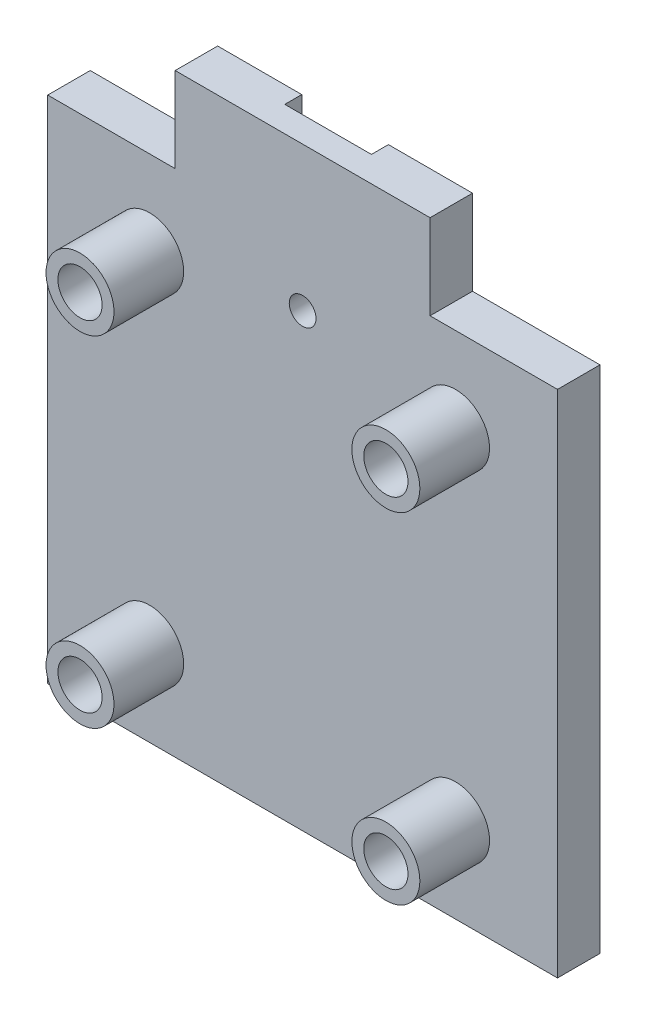
ISO-10303-21;
HEADER;
FILE_DESCRIPTION(('STEP AP214'),'2;1');
FILE_NAME('part.step','',(''),(''),'','','');
FILE_SCHEMA(('AUTOMOTIVE_DESIGN { 1 0 10303 214 1 1 1 1 }'));
ENDSEC;
DATA;
#1=APPLICATION_CONTEXT('core data for automotive mechanical design processes');
#2=APPLICATION_PROTOCOL_DEFINITION('international standard','automotive_design',2000,#1);
#3=PRODUCT_CONTEXT('',#1,'mechanical');
#4=PRODUCT('Part','Part','',(#3));
#5=PRODUCT_RELATED_PRODUCT_CATEGORY('part','',(#4));
#6=PRODUCT_DEFINITION_FORMATION('','',#4);
#7=PRODUCT_DEFINITION_CONTEXT('part definition',#1,'design');
#8=PRODUCT_DEFINITION('design','',#6,#7);
#9=PRODUCT_DEFINITION_SHAPE('','',#8);
#10=(LENGTH_UNIT() NAMED_UNIT(*) SI_UNIT(.MILLI.,.METRE.));
#11=(NAMED_UNIT(*) PLANE_ANGLE_UNIT() SI_UNIT($,.RADIAN.));
#12=(NAMED_UNIT(*) SI_UNIT($,.STERADIAN.) SOLID_ANGLE_UNIT());
#13=UNCERTAINTY_MEASURE_WITH_UNIT(LENGTH_MEASURE(1.E-05),#10,'distance_accuracy_value','');
#14=(GEOMETRIC_REPRESENTATION_CONTEXT(3) GLOBAL_UNCERTAINTY_ASSIGNED_CONTEXT((#13)) GLOBAL_UNIT_ASSIGNED_CONTEXT((#10,
#11,#12)) REPRESENTATION_CONTEXT('',''));
#15=CARTESIAN_POINT('',(0.,0.,0.));
#16=DIRECTION('',(0.,0.,1.));
#17=DIRECTION('',(1.,0.,0.));
#18=AXIS2_PLACEMENT_3D('',#15,#16,#17);
#19=CARTESIAN_POINT('',(0.,0.,0.));
#20=DIRECTION('',(0.,0.,-1.));
#21=DIRECTION('',(-1.,0.,0.));
#22=AXIS2_PLACEMENT_3D('',#19,#20,#21);
#23=PLANE('',#22);
#24=CARTESIAN_POINT('',(-22.86,25.4,0.));
#25=DIRECTION('',(0.,0.,1.));
#26=DIRECTION('',(-1.,0.,0.));
#27=AXIS2_PLACEMENT_3D('',#24,#25,#26);
#28=CIRCLE('',#27,3.302);
#29=CARTESIAN_POINT('',(-26.162,25.4,0.));
#30=VERTEX_POINT('',#29);
#31=EDGE_CURVE('E198',#30,#30,#28,.T.);
#32=ORIENTED_EDGE('',*,*,#31,.T.);
#33=EDGE_LOOP('',(#32));
#34=FACE_BOUND('',#33,.T.);
#35=CARTESIAN_POINT('',(22.86,25.4,0.));
#36=DIRECTION('',(0.,0.,1.));
#37=DIRECTION('',(1.,0.,0.));
#38=AXIS2_PLACEMENT_3D('',#35,#36,#37);
#39=CIRCLE('',#38,3.302);
#40=CARTESIAN_POINT('',(26.162,25.4,0.));
#41=VERTEX_POINT('',#40);
#42=EDGE_CURVE('E207',#41,#41,#39,.T.);
#43=ORIENTED_EDGE('',*,*,#42,.T.);
#44=EDGE_LOOP('',(#43));
#45=FACE_BOUND('',#44,.T.);
#46=CARTESIAN_POINT('',(-22.86,-25.4,0.));
#47=DIRECTION('',(0.,0.,-1.));
#48=DIRECTION('',(-1.,0.,0.));
#49=AXIS2_PLACEMENT_3D('',#46,#47,#48);
#50=CIRCLE('',#49,3.302);
#51=CARTESIAN_POINT('',(-26.162,-25.4,0.));
#52=VERTEX_POINT('',#51);
#53=EDGE_CURVE('E190',#52,#52,#50,.T.);
#54=ORIENTED_EDGE('',*,*,#53,.F.);
#55=EDGE_LOOP('',(#54));
#56=FACE_BOUND('',#55,.T.);
#57=CARTESIAN_POINT('',(22.86,-25.4,0.));
#58=DIRECTION('',(0.,0.,-1.));
#59=DIRECTION('',(1.,0.,0.));
#60=AXIS2_PLACEMENT_3D('',#57,#58,#59);
#61=CIRCLE('',#60,3.302);
#62=CARTESIAN_POINT('',(26.162,-25.4,0.));
#63=VERTEX_POINT('',#62);
#64=EDGE_CURVE('E183',#63,#63,#61,.T.);
#65=ORIENTED_EDGE('',*,*,#64,.F.);
#66=EDGE_LOOP('',(#65));
#67=FACE_BOUND('',#66,.T.);
#68=DIRECTION('',(1.,0.,0.));
#69=VECTOR('',#68,1.);
#70=CARTESIAN_POINT('',(-6.477,24.67,0.));
#71=LINE('',#70,#69);
#72=CARTESIAN_POINT('',(-6.477,24.67,0.));
#73=VERTEX_POINT('',#72);
#74=CARTESIAN_POINT('',(6.477,24.67,0.));
#75=VERTEX_POINT('',#74);
#76=EDGE_CURVE('E144',#73,#75,#71,.T.);
#77=ORIENTED_EDGE('',*,*,#76,.T.);
#78=DIRECTION('',(0.,1.,0.));
#79=VECTOR('',#78,1.);
#80=CARTESIAN_POINT('',(6.477,24.67,0.));
#81=LINE('',#80,#79);
#82=CARTESIAN_POINT('',(6.477,50.8,0.));
#83=VERTEX_POINT('',#82);
#84=EDGE_CURVE('E616',#75,#83,#81,.T.);
#85=ORIENTED_EDGE('',*,*,#84,.T.);
#86=DIRECTION('',(-1.,0.,0.));
#87=VECTOR('',#86,1.);
#88=CARTESIAN_POINT('',(-19.05,50.8,0.));
#89=LINE('',#88,#87);
#90=CARTESIAN_POINT('',(19.05,50.8,0.));
#91=VERTEX_POINT('',#90);
#92=EDGE_CURVE('E149',#91,#83,#89,.T.);
#93=ORIENTED_EDGE('',*,*,#92,.F.);
#94=DIRECTION('',(0.,1.,0.));
#95=VECTOR('',#94,1.);
#96=CARTESIAN_POINT('',(19.05,38.1,0.));
#97=LINE('',#96,#95);
#98=CARTESIAN_POINT('',(19.05,38.1,0.));
#99=VERTEX_POINT('',#98);
#100=EDGE_CURVE('E174',#99,#91,#97,.T.);
#101=ORIENTED_EDGE('',*,*,#100,.F.);
#102=DIRECTION('',(-1.,0.,0.));
#103=VECTOR('',#102,1.);
#104=CARTESIAN_POINT('',(-19.05,38.1,0.));
#105=LINE('',#104,#103);
#106=CARTESIAN_POINT('',(38.1,38.1,0.));
#107=VERTEX_POINT('',#106);
#108=EDGE_CURVE('E255',#107,#99,#105,.T.);
#109=ORIENTED_EDGE('',*,*,#108,.F.);
#110=DIRECTION('',(0.,1.,0.));
#111=VECTOR('',#110,1.);
#112=CARTESIAN_POINT('',(38.1,38.1,0.));
#113=LINE('',#112,#111);
#114=CARTESIAN_POINT('',(38.1,-38.1,0.));
#115=VERTEX_POINT('',#114);
#116=EDGE_CURVE('E242',#115,#107,#113,.T.);
#117=ORIENTED_EDGE('',*,*,#116,.F.);
#118=DIRECTION('',(1.,0.,0.));
#119=VECTOR('',#118,1.);
#120=CARTESIAN_POINT('',(-19.05,-38.1,0.));
#121=LINE('',#120,#119);
#122=CARTESIAN_POINT('',(-38.1,-38.1,0.));
#123=VERTEX_POINT('',#122);
#124=EDGE_CURVE('E258',#123,#115,#121,.T.);
#125=ORIENTED_EDGE('',*,*,#124,.F.);
#126=DIRECTION('',(0.,-1.,0.));
#127=VECTOR('',#126,1.);
#128=CARTESIAN_POINT('',(-38.1,38.1,0.));
#129=LINE('',#128,#127);
#130=CARTESIAN_POINT('',(-38.1,38.1,0.));
#131=VERTEX_POINT('',#130);
#132=EDGE_CURVE('E230',#131,#123,#129,.T.);
#133=ORIENTED_EDGE('',*,*,#132,.F.);
#134=CARTESIAN_POINT('',(-19.05,38.1,0.));
#135=VERTEX_POINT('',#134);
#136=EDGE_CURVE('E236',#135,#131,#105,.T.);
#137=ORIENTED_EDGE('',*,*,#136,.F.);
#138=DIRECTION('',(0.,-1.,0.));
#139=VECTOR('',#138,1.);
#140=CARTESIAN_POINT('',(-19.05,38.1,0.));
#141=LINE('',#140,#139);
#142=CARTESIAN_POINT('',(-19.05,50.8,0.));
#143=VERTEX_POINT('',#142);
#144=EDGE_CURVE('E168',#143,#135,#141,.T.);
#145=ORIENTED_EDGE('',*,*,#144,.F.);
#146=CARTESIAN_POINT('',(-6.477,50.8,0.));
#147=VERTEX_POINT('',#146);
#148=EDGE_CURVE('E173',#147,#143,#89,.T.);
#149=ORIENTED_EDGE('',*,*,#148,.F.);
#150=DIRECTION('',(0.,-1.,0.));
#151=VECTOR('',#150,1.);
#152=CARTESIAN_POINT('',(-6.477,24.67,0.));
#153=LINE('',#152,#151);
#154=EDGE_CURVE('E614',#147,#73,#153,.T.);
#155=ORIENTED_EDGE('',*,*,#154,.T.);
#156=EDGE_LOOP('',(#77,#85,#93,#101,#109,#117,#125,#133,#137,#145,#149,#155));
#157=FACE_BOUND('',#156,.T.);
#158=ADVANCED_FACE('F38',(#34,#45,#56,#67,#157),#23,.T.);
#159=CARTESIAN_POINT('',(-19.05,50.8,-40.1609262841384));
#160=DIRECTION('',(0.,1.,0.));
#161=DIRECTION('',(0.,0.,1.));
#162=AXIS2_PLACEMENT_3D('',#159,#160,#161);
#163=PLANE('',#162);
#164=ORIENTED_EDGE('',*,*,#92,.T.);
#165=DIRECTION('',(0.,0.,-1.));
#166=VECTOR('',#165,1.);
#167=CARTESIAN_POINT('',(6.477,50.8,2.54));
#168=LINE('',#167,#166);
#169=CARTESIAN_POINT('',(6.477,50.8,2.54));
#170=VERTEX_POINT('',#169);
#171=EDGE_CURVE('E141',#170,#83,#168,.T.);
#172=ORIENTED_EDGE('',*,*,#171,.F.);
#173=DIRECTION('',(-1.,0.,0.));
#174=VECTOR('',#173,1.);
#175=CARTESIAN_POINT('',(-6.477,50.8,2.54));
#176=LINE('',#175,#174);
#177=CARTESIAN_POINT('',(-6.477,50.8,2.54));
#178=VERTEX_POINT('',#177);
#179=EDGE_CURVE('E128',#170,#178,#176,.T.);
#180=ORIENTED_EDGE('',*,*,#179,.T.);
#181=DIRECTION('',(0.,0.,-1.));
#182=VECTOR('',#181,1.);
#183=CARTESIAN_POINT('',(-6.477,50.8,2.54));
#184=LINE('',#183,#182);
#185=EDGE_CURVE('E150',#178,#147,#184,.T.);
#186=ORIENTED_EDGE('',*,*,#185,.T.);
#187=ORIENTED_EDGE('',*,*,#148,.T.);
#188=DIRECTION('',(0.,0.,1.));
#189=VECTOR('',#188,1.);
#190=CARTESIAN_POINT('',(-19.05,50.8,-40.1609262841384));
#191=LINE('',#190,#189);
#192=CARTESIAN_POINT('',(-19.05,50.8,6.35));
#193=VERTEX_POINT('',#192);
#194=EDGE_CURVE('E171',#143,#193,#191,.T.);
#195=ORIENTED_EDGE('',*,*,#194,.T.);
#196=DIRECTION('',(-1.,0.,0.));
#197=VECTOR('',#196,1.);
#198=CARTESIAN_POINT('',(-19.05,50.8,6.35));
#199=LINE('',#198,#197);
#200=CARTESIAN_POINT('',(19.05,50.8,6.35));
#201=VERTEX_POINT('',#200);
#202=EDGE_CURVE('E161',#201,#193,#199,.T.);
#203=ORIENTED_EDGE('',*,*,#202,.F.);
#204=DIRECTION('',(0.,0.,1.));
#205=VECTOR('',#204,1.);
#206=CARTESIAN_POINT('',(19.05,50.8,-40.1609262841384));
#207=LINE('',#206,#205);
#208=EDGE_CURVE('E177',#91,#201,#207,.T.);
#209=ORIENTED_EDGE('',*,*,#208,.F.);
#210=EDGE_LOOP('',(#164,#172,#180,#186,#187,#195,#203,#209));
#211=FACE_BOUND('',#210,.T.);
#212=ADVANCED_FACE('F147',(#211),#163,.T.);
#213=CARTESIAN_POINT('',(0.,29.21,16.764));
#214=DIRECTION('',(0.,0.,-1.));
#215=DIRECTION('',(-1.,0.,0.));
#216=AXIS2_PLACEMENT_3D('',#213,#214,#215);
#217=CYLINDRICAL_SURFACE('',#216,2.);
#218=CARTESIAN_POINT('',(0.,29.21,6.35));
#219=DIRECTION('',(0.,0.,-1.));
#220=DIRECTION('',(-1.,0.,0.));
#221=AXIS2_PLACEMENT_3D('',#218,#219,#220);
#222=CIRCLE('',#221,2.);
#223=CARTESIAN_POINT('',(-2.00000000000001,29.21,6.35));
#224=VERTEX_POINT('',#223);
#225=EDGE_CURVE('E153',#224,#224,#222,.T.);
#226=ORIENTED_EDGE('',*,*,#225,.F.);
#227=EDGE_LOOP('',(#226));
#228=FACE_BOUND('',#227,.T.);
#229=CARTESIAN_POINT('',(0.,29.21,2.54));
#230=DIRECTION('',(0.,0.,-1.));
#231=DIRECTION('',(-1.,0.,0.));
#232=AXIS2_PLACEMENT_3D('',#229,#230,#231);
#233=CIRCLE('',#232,2.);
#234=CARTESIAN_POINT('',(-2.00000000000001,29.21,2.54));
#235=VERTEX_POINT('',#234);
#236=EDGE_CURVE('E42',#235,#235,#233,.F.);
#237=ORIENTED_EDGE('',*,*,#236,.F.);
#238=EDGE_LOOP('',(#237));
#239=FACE_BOUND('',#238,.T.);
#240=ADVANCED_FACE('F320',(#228,#239),#217,.F.);
#241=CARTESIAN_POINT('',(-19.05,38.1,6.35));
#242=DIRECTION('',(0.,-1.,0.));
#243=DIRECTION('',(0.,0.,-1.));
#244=AXIS2_PLACEMENT_3D('',#241,#242,#243);
#245=PLANE('',#244);
#246=DIRECTION('',(0.,0.,1.));
#247=VECTOR('',#246,1.);
#248=CARTESIAN_POINT('',(-19.05,38.1,-40.1609262841384));
#249=LINE('',#248,#247);
#250=CARTESIAN_POINT('',(-19.05,38.1,6.35));
#251=VERTEX_POINT('',#250);
#252=EDGE_CURVE('E170',#135,#251,#249,.T.);
#253=ORIENTED_EDGE('',*,*,#252,.F.);
#254=ORIENTED_EDGE('',*,*,#136,.T.);
#255=DIRECTION('',(0.,0.,1.));
#256=VECTOR('',#255,1.);
#257=CARTESIAN_POINT('',(-38.1,38.1,-78.5451621680164));
#258=LINE('',#257,#256);
#259=CARTESIAN_POINT('',(-38.1,38.1,6.35));
#260=VERTEX_POINT('',#259);
#261=EDGE_CURVE('E228',#131,#260,#258,.T.);
#262=ORIENTED_EDGE('',*,*,#261,.T.);
#263=DIRECTION('',(-1.,0.,0.));
#264=VECTOR('',#263,1.);
#265=CARTESIAN_POINT('',(-19.05,38.1,6.35));
#266=LINE('',#265,#264);
#267=EDGE_CURVE('E253',#251,#260,#266,.T.);
#268=ORIENTED_EDGE('',*,*,#267,.F.);
#269=EDGE_LOOP('',(#253,#254,#262,#268));
#270=FACE_BOUND('',#269,.T.);
#271=ADVANCED_FACE('F291',(#270),#245,.F.);
#272=CARTESIAN_POINT('',(-38.1,38.1,-78.5451621680164));
#273=DIRECTION('',(-1.,0.,0.));
#274=DIRECTION('',(0.,-1.,0.));
#275=AXIS2_PLACEMENT_3D('',#272,#273,#274);
#276=PLANE('',#275);
#277=ORIENTED_EDGE('',*,*,#261,.F.);
#278=ORIENTED_EDGE('',*,*,#132,.T.);
#279=DIRECTION('',(0.,0.,1.));
#280=VECTOR('',#279,1.);
#281=CARTESIAN_POINT('',(-38.1,-38.1,-78.5451621680164));
#282=LINE('',#281,#280);
#283=CARTESIAN_POINT('',(-38.1,-38.1,6.35));
#284=VERTEX_POINT('',#283);
#285=EDGE_CURVE('E233',#123,#284,#282,.T.);
#286=ORIENTED_EDGE('',*,*,#285,.T.);
#287=DIRECTION('',(0.,-1.,0.));
#288=VECTOR('',#287,1.);
#289=CARTESIAN_POINT('',(-38.1,38.1,6.35));
#290=LINE('',#289,#288);
#291=EDGE_CURVE('E225',#260,#284,#290,.T.);
#292=ORIENTED_EDGE('',*,*,#291,.F.);
#293=EDGE_LOOP('',(#277,#278,#286,#292));
#294=FACE_BOUND('',#293,.T.);
#295=ADVANCED_FACE('F296',(#294),#276,.T.);
#296=ORIENTED_EDGE('',*,*,#108,.T.);
#297=DIRECTION('',(0.,0.,1.));
#298=VECTOR('',#297,1.);
#299=CARTESIAN_POINT('',(19.05,38.1,-40.1609262841384));
#300=LINE('',#299,#298);
#301=CARTESIAN_POINT('',(19.05,38.1,6.35));
#302=VERTEX_POINT('',#301);
#303=EDGE_CURVE('E164',#99,#302,#300,.T.);
#304=ORIENTED_EDGE('',*,*,#303,.T.);
#305=CARTESIAN_POINT('',(38.1,38.1,6.35));
#306=VERTEX_POINT('',#305);
#307=EDGE_CURVE('E249',#306,#302,#266,.T.);
#308=ORIENTED_EDGE('',*,*,#307,.F.);
#309=DIRECTION('',(0.,0.,1.));
#310=VECTOR('',#309,1.);
#311=CARTESIAN_POINT('',(38.1,38.1,-78.5451621680164));
#312=LINE('',#311,#310);
#313=EDGE_CURVE('E222',#107,#306,#312,.T.);
#314=ORIENTED_EDGE('',*,*,#313,.F.);
#315=EDGE_LOOP('',(#296,#304,#308,#314));
#316=FACE_BOUND('',#315,.T.);
#317=ADVANCED_FACE('F40',(#316),#245,.F.);
#318=CARTESIAN_POINT('',(-19.05,-38.1,6.35));
#319=DIRECTION('',(0.,1.,0.));
#320=DIRECTION('',(0.,0.,1.));
#321=AXIS2_PLACEMENT_3D('',#318,#319,#320);
#322=PLANE('',#321);
#323=ORIENTED_EDGE('',*,*,#124,.T.);
#324=DIRECTION('',(0.,0.,1.));
#325=VECTOR('',#324,1.);
#326=CARTESIAN_POINT('',(38.1,-38.1,-78.5451621680164));
#327=LINE('',#326,#325);
#328=CARTESIAN_POINT('',(38.1,-38.1,6.35));
#329=VERTEX_POINT('',#328);
#330=EDGE_CURVE('E239',#115,#329,#327,.T.);
#331=ORIENTED_EDGE('',*,*,#330,.T.);
#332=DIRECTION('',(1.,0.,0.));
#333=VECTOR('',#332,1.);
#334=CARTESIAN_POINT('',(-19.05,-38.1,6.35));
#335=LINE('',#334,#333);
#336=EDGE_CURVE('E252',#284,#329,#335,.T.);
#337=ORIENTED_EDGE('',*,*,#336,.F.);
#338=ORIENTED_EDGE('',*,*,#285,.F.);
#339=EDGE_LOOP('',(#323,#331,#337,#338));
#340=FACE_BOUND('',#339,.T.);
#341=ADVANCED_FACE('F269',(#340),#322,.F.);
#342=CARTESIAN_POINT('',(0.,0.,6.35));
#343=DIRECTION('',(0.,0.,-1.));
#344=DIRECTION('',(-1.,0.,0.));
#345=AXIS2_PLACEMENT_3D('',#342,#343,#344);
#346=PLANE('',#345);
#347=ORIENTED_EDGE('',*,*,#225,.T.);
#348=EDGE_LOOP('',(#347));
#349=FACE_BOUND('',#348,.T.);
#350=CARTESIAN_POINT('',(22.86,-25.4,6.35));
#351=DIRECTION('',(0.,0.,-1.));
#352=DIRECTION('',(1.,0.,0.));
#353=AXIS2_PLACEMENT_3D('',#350,#351,#352);
#354=CIRCLE('',#353,5.08);
#355=CARTESIAN_POINT('',(27.94,-25.4,6.35));
#356=VERTEX_POINT('',#355);
#357=EDGE_CURVE('E199',#356,#356,#354,.T.);
#358=ORIENTED_EDGE('',*,*,#357,.T.);
#359=EDGE_LOOP('',(#358));
#360=FACE_BOUND('',#359,.T.);
#361=CARTESIAN_POINT('',(-22.86,-25.4,6.35));
#362=DIRECTION('',(0.,0.,-1.));
#363=DIRECTION('',(-1.,0.,0.));
#364=AXIS2_PLACEMENT_3D('',#361,#362,#363);
#365=CIRCLE('',#364,5.08);
#366=CARTESIAN_POINT('',(-27.94,-25.4,6.35));
#367=VERTEX_POINT('',#366);
#368=EDGE_CURVE('E186',#367,#367,#365,.T.);
#369=ORIENTED_EDGE('',*,*,#368,.T.);
#370=EDGE_LOOP('',(#369));
#371=FACE_BOUND('',#370,.T.);
#372=CARTESIAN_POINT('',(22.86,25.4,6.35));
#373=DIRECTION('',(0.,0.,-1.));
#374=DIRECTION('',(-1.,0.,0.));
#375=AXIS2_PLACEMENT_3D('',#372,#373,#374);
#376=CIRCLE('',#375,5.08);
#377=CARTESIAN_POINT('',(17.78,25.4,6.35));
#378=VERTEX_POINT('',#377);
#379=EDGE_CURVE('E11',#378,#378,#376,.F.);
#380=ORIENTED_EDGE('',*,*,#379,.F.);
#381=EDGE_LOOP('',(#380));
#382=FACE_BOUND('',#381,.T.);
#383=CARTESIAN_POINT('',(-22.86,25.4,6.35));
#384=DIRECTION('',(0.,0.,-1.));
#385=DIRECTION('',(-1.,0.,0.));
#386=AXIS2_PLACEMENT_3D('',#383,#384,#385);
#387=CIRCLE('',#386,5.08);
#388=CARTESIAN_POINT('',(-27.94,25.4,6.35));
#389=VERTEX_POINT('',#388);
#390=EDGE_CURVE('E47',#389,#389,#387,.F.);
#391=ORIENTED_EDGE('',*,*,#390,.F.);
#392=EDGE_LOOP('',(#391));
#393=FACE_BOUND('',#392,.T.);
#394=ORIENTED_EDGE('',*,*,#336,.T.);
#395=DIRECTION('',(0.,1.,0.));
#396=VECTOR('',#395,1.);
#397=CARTESIAN_POINT('',(38.1,38.1,6.35));
#398=LINE('',#397,#396);
#399=EDGE_CURVE('E229',#329,#306,#398,.T.);
#400=ORIENTED_EDGE('',*,*,#399,.T.);
#401=ORIENTED_EDGE('',*,*,#307,.T.);
#402=DIRECTION('',(0.,1.,0.));
#403=VECTOR('',#402,1.);
#404=CARTESIAN_POINT('',(19.05,38.1,6.35));
#405=LINE('',#404,#403);
#406=EDGE_CURVE('E62',#302,#201,#405,.T.);
#407=ORIENTED_EDGE('',*,*,#406,.T.);
#408=ORIENTED_EDGE('',*,*,#202,.T.);
#409=DIRECTION('',(0.,-1.,0.));
#410=VECTOR('',#409,1.);
#411=CARTESIAN_POINT('',(-19.05,38.1,6.35));
#412=LINE('',#411,#410);
#413=EDGE_CURVE('E160',#193,#251,#412,.T.);
#414=ORIENTED_EDGE('',*,*,#413,.T.);
#415=ORIENTED_EDGE('',*,*,#267,.T.);
#416=ORIENTED_EDGE('',*,*,#291,.T.);
#417=EDGE_LOOP('',(#394,#400,#401,#407,#408,#414,#415,#416));
#418=FACE_BOUND('',#417,.T.);
#419=ADVANCED_FACE('F265',(#349,#360,#371,#382,#393,#418),#346,.F.);
#420=CARTESIAN_POINT('',(38.1,38.1,-78.5451621680164));
#421=DIRECTION('',(1.,0.,0.));
#422=DIRECTION('',(0.,1.,0.));
#423=AXIS2_PLACEMENT_3D('',#420,#421,#422);
#424=PLANE('',#423);
#425=ORIENTED_EDGE('',*,*,#330,.F.);
#426=ORIENTED_EDGE('',*,*,#116,.T.);
#427=ORIENTED_EDGE('',*,*,#313,.T.);
#428=ORIENTED_EDGE('',*,*,#399,.F.);
#429=EDGE_LOOP('',(#425,#426,#427,#428));
#430=FACE_BOUND('',#429,.T.);
#431=ADVANCED_FACE('F268',(#430),#424,.T.);
#432=CARTESIAN_POINT('',(-22.86,25.4,16.764));
#433=DIRECTION('',(0.,0.,-1.));
#434=DIRECTION('',(-1.,0.,0.));
#435=AXIS2_PLACEMENT_3D('',#432,#433,#434);
#436=CYLINDRICAL_SURFACE('',#435,5.08);
#437=CARTESIAN_POINT('',(-22.86,25.4,16.764));
#438=DIRECTION('',(0.,0.,1.));
#439=DIRECTION('',(-1.,0.,0.));
#440=AXIS2_PLACEMENT_3D('',#437,#438,#439);
#441=CIRCLE('',#440,5.08);
#442=CARTESIAN_POINT('',(-27.94,25.4,16.764));
#443=VERTEX_POINT('',#442);
#444=EDGE_CURVE('E210',#443,#443,#441,.T.);
#445=ORIENTED_EDGE('',*,*,#444,.F.);
#446=EDGE_LOOP('',(#445));
#447=FACE_BOUND('',#446,.T.);
#448=ORIENTED_EDGE('',*,*,#390,.T.);
#449=EDGE_LOOP('',(#448));
#450=FACE_BOUND('',#449,.T.);
#451=ADVANCED_FACE('F263',(#447,#450),#436,.T.);
#452=CARTESIAN_POINT('',(-22.86,25.4,16.764));
#453=DIRECTION('',(0.,0.,-1.));
#454=DIRECTION('',(-1.,0.,0.));
#455=AXIS2_PLACEMENT_3D('',#452,#453,#454);
#456=PLANE('',#455);
#457=CARTESIAN_POINT('',(-22.86,25.4,16.764));
#458=DIRECTION('',(0.,0.,1.));
#459=DIRECTION('',(-1.,0.,0.));
#460=AXIS2_PLACEMENT_3D('',#457,#458,#459);
#461=CIRCLE('',#460,3.302);
#462=CARTESIAN_POINT('',(-26.162,25.4,16.764));
#463=VERTEX_POINT('',#462);
#464=EDGE_CURVE('E214',#463,#463,#461,.T.);
#465=ORIENTED_EDGE('',*,*,#464,.F.);
#466=EDGE_LOOP('',(#465));
#467=FACE_BOUND('',#466,.T.);
#468=ORIENTED_EDGE('',*,*,#444,.T.);
#469=EDGE_LOOP('',(#468));
#470=FACE_BOUND('',#469,.T.);
#471=ADVANCED_FACE('F490',(#467,#470),#456,.F.);
#472=CARTESIAN_POINT('',(22.86,25.4,16.764));
#473=DIRECTION('',(0.,0.,-1.));
#474=DIRECTION('',(-1.,0.,0.));
#475=AXIS2_PLACEMENT_3D('',#472,#473,#474);
#476=CYLINDRICAL_SURFACE('',#475,5.08);
#477=CARTESIAN_POINT('',(22.86,25.4,16.764));
#478=DIRECTION('',(0.,0.,1.));
#479=DIRECTION('',(1.,0.,0.));
#480=AXIS2_PLACEMENT_3D('',#477,#478,#479);
#481=CIRCLE('',#480,5.08);
#482=CARTESIAN_POINT('',(27.94,25.4,16.764));
#483=VERTEX_POINT('',#482);
#484=EDGE_CURVE('E219',#483,#483,#481,.T.);
#485=ORIENTED_EDGE('',*,*,#484,.F.);
#486=EDGE_LOOP('',(#485));
#487=FACE_BOUND('',#486,.T.);
#488=ORIENTED_EDGE('',*,*,#379,.T.);
#489=EDGE_LOOP('',(#488));
#490=FACE_BOUND('',#489,.T.);
#491=ADVANCED_FACE('F481',(#487,#490),#476,.T.);
#492=CARTESIAN_POINT('',(22.86,25.4,16.764));
#493=DIRECTION('',(0.,0.,1.));
#494=DIRECTION('',(1.,0.,0.));
#495=AXIS2_PLACEMENT_3D('',#492,#493,#494);
#496=PLANE('',#495);
#497=CARTESIAN_POINT('',(22.86,25.4,16.764));
#498=DIRECTION('',(0.,0.,1.));
#499=DIRECTION('',(1.,0.,0.));
#500=AXIS2_PLACEMENT_3D('',#497,#498,#499);
#501=CIRCLE('',#500,3.302);
#502=CARTESIAN_POINT('',(26.162,25.4,16.764));
#503=VERTEX_POINT('',#502);
#504=EDGE_CURVE('E211',#503,#503,#501,.T.);
#505=ORIENTED_EDGE('',*,*,#504,.F.);
#506=EDGE_LOOP('',(#505));
#507=FACE_BOUND('',#506,.T.);
#508=ORIENTED_EDGE('',*,*,#484,.T.);
#509=EDGE_LOOP('',(#508));
#510=FACE_BOUND('',#509,.T.);
#511=ADVANCED_FACE('F472',(#507,#510),#496,.T.);
#512=CARTESIAN_POINT('',(22.86,25.4,0.));
#513=DIRECTION('',(0.,0.,1.));
#514=DIRECTION('',(1.,0.,0.));
#515=AXIS2_PLACEMENT_3D('',#512,#513,#514);
#516=CYLINDRICAL_SURFACE('',#515,3.302);
#517=ORIENTED_EDGE('',*,*,#42,.F.);
#518=EDGE_LOOP('',(#517));
#519=FACE_BOUND('',#518,.T.);
#520=ORIENTED_EDGE('',*,*,#504,.T.);
#521=EDGE_LOOP('',(#520));
#522=FACE_BOUND('',#521,.T.);
#523=ADVANCED_FACE('F463',(#519,#522),#516,.F.);
#524=CARTESIAN_POINT('',(-22.86,25.4,0.));
#525=DIRECTION('',(0.,0.,1.));
#526=DIRECTION('',(1.,0.,0.));
#527=AXIS2_PLACEMENT_3D('',#524,#525,#526);
#528=CYLINDRICAL_SURFACE('',#527,3.302);
#529=ORIENTED_EDGE('',*,*,#31,.F.);
#530=EDGE_LOOP('',(#529));
#531=FACE_BOUND('',#530,.T.);
#532=ORIENTED_EDGE('',*,*,#464,.T.);
#533=EDGE_LOOP('',(#532));
#534=FACE_BOUND('',#533,.T.);
#535=ADVANCED_FACE('F454',(#531,#534),#528,.F.);
#536=CARTESIAN_POINT('',(-22.86,-25.4,16.764));
#537=DIRECTION('',(0.,0.,-1.));
#538=DIRECTION('',(-1.,0.,0.));
#539=AXIS2_PLACEMENT_3D('',#536,#537,#538);
#540=CYLINDRICAL_SURFACE('',#539,5.08);
#541=CARTESIAN_POINT('',(-22.86,-25.4,16.764));
#542=DIRECTION('',(0.,0.,-1.));
#543=DIRECTION('',(-1.,0.,0.));
#544=AXIS2_PLACEMENT_3D('',#541,#542,#543);
#545=CIRCLE('',#544,5.08);
#546=CARTESIAN_POINT('',(-27.94,-25.4,16.764));
#547=VERTEX_POINT('',#546);
#548=EDGE_CURVE('E202',#547,#547,#545,.T.);
#549=ORIENTED_EDGE('',*,*,#548,.T.);
#550=EDGE_LOOP('',(#549));
#551=FACE_BOUND('',#550,.T.);
#552=ORIENTED_EDGE('',*,*,#368,.F.);
#553=EDGE_LOOP('',(#552));
#554=FACE_BOUND('',#553,.T.);
#555=ADVANCED_FACE('F445',(#551,#554),#540,.T.);
#556=CARTESIAN_POINT('',(-22.86,-25.4,16.764));
#557=DIRECTION('',(0.,0.,-1.));
#558=DIRECTION('',(-1.,0.,0.));
#559=AXIS2_PLACEMENT_3D('',#556,#557,#558);
#560=PLANE('',#559);
#561=CARTESIAN_POINT('',(-22.86,-25.4,16.764));
#562=DIRECTION('',(0.,0.,-1.));
#563=DIRECTION('',(-1.,0.,0.));
#564=AXIS2_PLACEMENT_3D('',#561,#562,#563);
#565=CIRCLE('',#564,3.302);
#566=CARTESIAN_POINT('',(-26.162,-25.4,16.764));
#567=VERTEX_POINT('',#566);
#568=EDGE_CURVE('E182',#567,#567,#565,.T.);
#569=ORIENTED_EDGE('',*,*,#568,.T.);
#570=EDGE_LOOP('',(#569));
#571=FACE_BOUND('',#570,.T.);
#572=ORIENTED_EDGE('',*,*,#548,.F.);
#573=EDGE_LOOP('',(#572));
#574=FACE_BOUND('',#573,.T.);
#575=ADVANCED_FACE('F436',(#571,#574),#560,.F.);
#576=CARTESIAN_POINT('',(22.86,-25.4,16.764));
#577=DIRECTION('',(0.,0.,-1.));
#578=DIRECTION('',(-1.,0.,0.));
#579=AXIS2_PLACEMENT_3D('',#576,#577,#578);
#580=CYLINDRICAL_SURFACE('',#579,5.08);
#581=CARTESIAN_POINT('',(22.86,-25.4,16.764));
#582=DIRECTION('',(0.,0.,-1.));
#583=DIRECTION('',(1.,0.,0.));
#584=AXIS2_PLACEMENT_3D('',#581,#582,#583);
#585=CIRCLE('',#584,5.08);
#586=CARTESIAN_POINT('',(27.94,-25.4,16.764));
#587=VERTEX_POINT('',#586);
#588=EDGE_CURVE('E195',#587,#587,#585,.T.);
#589=ORIENTED_EDGE('',*,*,#588,.T.);
#590=EDGE_LOOP('',(#589));
#591=FACE_BOUND('',#590,.T.);
#592=ORIENTED_EDGE('',*,*,#357,.F.);
#593=EDGE_LOOP('',(#592));
#594=FACE_BOUND('',#593,.T.);
#595=ADVANCED_FACE('F427',(#591,#594),#580,.T.);
#596=CARTESIAN_POINT('',(22.86,-25.4,16.764));
#597=DIRECTION('',(0.,0.,1.));
#598=DIRECTION('',(1.,0.,0.));
#599=AXIS2_PLACEMENT_3D('',#596,#597,#598);
#600=PLANE('',#599);
#601=CARTESIAN_POINT('',(22.86,-25.4,16.764));
#602=DIRECTION('',(0.,0.,-1.));
#603=DIRECTION('',(1.,0.,0.));
#604=AXIS2_PLACEMENT_3D('',#601,#602,#603);
#605=CIRCLE('',#604,3.302);
#606=CARTESIAN_POINT('',(26.162,-25.4,16.764));
#607=VERTEX_POINT('',#606);
#608=EDGE_CURVE('E187',#607,#607,#605,.T.);
#609=ORIENTED_EDGE('',*,*,#608,.T.);
#610=EDGE_LOOP('',(#609));
#611=FACE_BOUND('',#610,.T.);
#612=ORIENTED_EDGE('',*,*,#588,.F.);
#613=EDGE_LOOP('',(#612));
#614=FACE_BOUND('',#613,.T.);
#615=ADVANCED_FACE('F419',(#611,#614),#600,.T.);
#616=CARTESIAN_POINT('',(22.86,-25.4,0.));
#617=DIRECTION('',(0.,0.,1.));
#618=DIRECTION('',(1.,0.,0.));
#619=AXIS2_PLACEMENT_3D('',#616,#617,#618);
#620=CYLINDRICAL_SURFACE('',#619,3.302);
#621=ORIENTED_EDGE('',*,*,#64,.T.);
#622=EDGE_LOOP('',(#621));
#623=FACE_BOUND('',#622,.T.);
#624=ORIENTED_EDGE('',*,*,#608,.F.);
#625=EDGE_LOOP('',(#624));
#626=FACE_BOUND('',#625,.T.);
#627=ADVANCED_FACE('F309',(#623,#626),#620,.F.);
#628=CARTESIAN_POINT('',(-22.86,-25.4,0.));
#629=DIRECTION('',(0.,0.,1.));
#630=DIRECTION('',(1.,0.,0.));
#631=AXIS2_PLACEMENT_3D('',#628,#629,#630);
#632=CYLINDRICAL_SURFACE('',#631,3.302);
#633=ORIENTED_EDGE('',*,*,#53,.T.);
#634=EDGE_LOOP('',(#633));
#635=FACE_BOUND('',#634,.T.);
#636=ORIENTED_EDGE('',*,*,#568,.F.);
#637=EDGE_LOOP('',(#636));
#638=FACE_BOUND('',#637,.T.);
#639=ADVANCED_FACE('F301',(#635,#638),#632,.F.);
#640=CARTESIAN_POINT('',(19.05,38.1,-40.1609262841384));
#641=DIRECTION('',(1.,0.,0.));
#642=DIRECTION('',(0.,1.,0.));
#643=AXIS2_PLACEMENT_3D('',#640,#641,#642);
#644=PLANE('',#643);
#645=ORIENTED_EDGE('',*,*,#303,.F.);
#646=ORIENTED_EDGE('',*,*,#100,.T.);
#647=ORIENTED_EDGE('',*,*,#208,.T.);
#648=ORIENTED_EDGE('',*,*,#406,.F.);
#649=EDGE_LOOP('',(#645,#646,#647,#648));
#650=FACE_BOUND('',#649,.T.);
#651=ADVANCED_FACE('F299',(#650),#644,.T.);
#652=CARTESIAN_POINT('',(-19.05,38.1,-40.1609262841384));
#653=DIRECTION('',(-1.,0.,0.));
#654=DIRECTION('',(0.,-1.,0.));
#655=AXIS2_PLACEMENT_3D('',#652,#653,#654);
#656=PLANE('',#655);
#657=ORIENTED_EDGE('',*,*,#194,.F.);
#658=ORIENTED_EDGE('',*,*,#144,.T.);
#659=ORIENTED_EDGE('',*,*,#252,.T.);
#660=ORIENTED_EDGE('',*,*,#413,.F.);
#661=EDGE_LOOP('',(#657,#658,#659,#660));
#662=FACE_BOUND('',#661,.T.);
#663=ADVANCED_FACE('F287',(#662),#656,.T.);
#664=CARTESIAN_POINT('',(0.,0.,2.54));
#665=DIRECTION('',(0.,0.,-1.));
#666=DIRECTION('',(-1.,0.,0.));
#667=AXIS2_PLACEMENT_3D('',#664,#665,#666);
#668=PLANE('',#667);
#669=DIRECTION('',(0.,1.,0.));
#670=VECTOR('',#669,1.);
#671=CARTESIAN_POINT('',(6.477,24.67,2.54));
#672=LINE('',#671,#670);
#673=CARTESIAN_POINT('',(6.477,24.67,2.54));
#674=VERTEX_POINT('',#673);
#675=EDGE_CURVE('E132',#674,#170,#672,.T.);
#676=ORIENTED_EDGE('',*,*,#675,.F.);
#677=DIRECTION('',(1.,0.,0.));
#678=VECTOR('',#677,1.);
#679=CARTESIAN_POINT('',(-6.477,24.67,2.54));
#680=LINE('',#679,#678);
#681=CARTESIAN_POINT('',(-6.477,24.67,2.54));
#682=VERTEX_POINT('',#681);
#683=EDGE_CURVE('E621',#682,#674,#680,.T.);
#684=ORIENTED_EDGE('',*,*,#683,.F.);
#685=DIRECTION('',(0.,-1.,0.));
#686=VECTOR('',#685,1.);
#687=CARTESIAN_POINT('',(-6.477,24.67,2.54));
#688=LINE('',#687,#686);
#689=EDGE_CURVE('E54',#178,#682,#688,.T.);
#690=ORIENTED_EDGE('',*,*,#689,.F.);
#691=ORIENTED_EDGE('',*,*,#179,.F.);
#692=EDGE_LOOP('',(#676,#684,#690,#691));
#693=FACE_BOUND('',#692,.T.);
#694=ORIENTED_EDGE('',*,*,#236,.T.);
#695=EDGE_LOOP('',(#694));
#696=FACE_BOUND('',#695,.T.);
#697=ADVANCED_FACE('F130',(#693,#696),#668,.T.);
#698=CARTESIAN_POINT('',(6.477,24.67,2.54));
#699=DIRECTION('',(-1.,0.,0.));
#700=DIRECTION('',(0.,0.,1.));
#701=AXIS2_PLACEMENT_3D('',#698,#699,#700);
#702=PLANE('',#701);
#703=ORIENTED_EDGE('',*,*,#84,.F.);
#704=DIRECTION('',(0.,0.,-1.));
#705=VECTOR('',#704,1.);
#706=CARTESIAN_POINT('',(6.477,24.67,2.54));
#707=LINE('',#706,#705);
#708=EDGE_CURVE('E143',#674,#75,#707,.T.);
#709=ORIENTED_EDGE('',*,*,#708,.F.);
#710=ORIENTED_EDGE('',*,*,#675,.T.);
#711=ORIENTED_EDGE('',*,*,#171,.T.);
#712=EDGE_LOOP('',(#703,#709,#710,#711));
#713=FACE_BOUND('',#712,.T.);
#714=ADVANCED_FACE('F140',(#713),#702,.T.);
#715=CARTESIAN_POINT('',(-6.477,24.67,2.54));
#716=DIRECTION('',(1.,0.,0.));
#717=DIRECTION('',(0.,0.,-1.));
#718=AXIS2_PLACEMENT_3D('',#715,#716,#717);
#719=PLANE('',#718);
#720=ORIENTED_EDGE('',*,*,#154,.F.);
#721=ORIENTED_EDGE('',*,*,#185,.F.);
#722=ORIENTED_EDGE('',*,*,#689,.T.);
#723=DIRECTION('',(0.,0.,-1.));
#724=VECTOR('',#723,1.);
#725=CARTESIAN_POINT('',(-6.477,24.67,2.54));
#726=LINE('',#725,#724);
#727=EDGE_CURVE('E154',#682,#73,#726,.T.);
#728=ORIENTED_EDGE('',*,*,#727,.T.);
#729=EDGE_LOOP('',(#720,#721,#722,#728));
#730=FACE_BOUND('',#729,.T.);
#731=ADVANCED_FACE('F345',(#730),#719,.T.);
#732=CARTESIAN_POINT('',(-6.477,24.67,2.54));
#733=DIRECTION('',(0.,1.,0.));
#734=DIRECTION('',(0.,0.,1.));
#735=AXIS2_PLACEMENT_3D('',#732,#733,#734);
#736=PLANE('',#735);
#737=ORIENTED_EDGE('',*,*,#76,.F.);
#738=ORIENTED_EDGE('',*,*,#727,.F.);
#739=ORIENTED_EDGE('',*,*,#683,.T.);
#740=ORIENTED_EDGE('',*,*,#708,.T.);
#741=EDGE_LOOP('',(#737,#738,#739,#740));
#742=FACE_BOUND('',#741,.T.);
#743=ADVANCED_FACE('F348',(#742),#736,.T.);
#744=CLOSED_SHELL('',(#158,#212,#240,#271,#295,#317,#341,#419,#431,#451,#471,#491,#511,#523,
#535,#555,#575,#595,#615,#627,#639,#651,#663,#697,#714,#731,#743));
#745=MANIFOLD_SOLID_BREP('B2',#744);
#746=ADVANCED_BREP_SHAPE_REPRESENTATION('',(#18,#745),#14);
#747=SHAPE_DEFINITION_REPRESENTATION(#9,#746);
ENDSEC;
END-ISO-10303-21;
